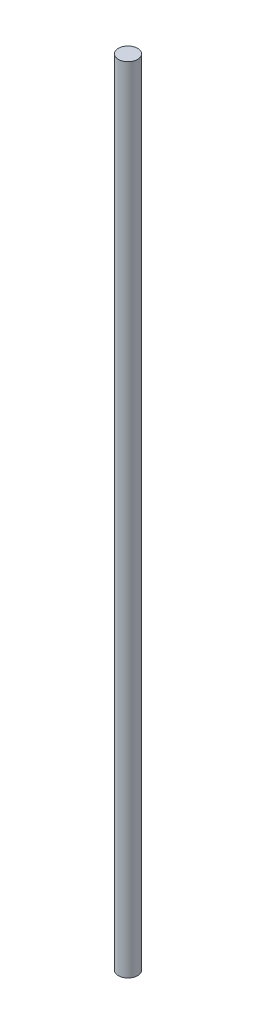
ISO-10303-21;
HEADER;
FILE_DESCRIPTION(('STEP AP214'),'2;1');
FILE_NAME('part.step','',(''),(''),'','','');
FILE_SCHEMA(('AUTOMOTIVE_DESIGN { 1 0 10303 214 1 1 1 1 }'));
ENDSEC;
DATA;
#1=APPLICATION_CONTEXT('core data for automotive mechanical design processes');
#2=APPLICATION_PROTOCOL_DEFINITION('international standard','automotive_design',2000,#1);
#3=PRODUCT_CONTEXT('',#1,'mechanical');
#4=PRODUCT('Part','Part','',(#3));
#5=PRODUCT_RELATED_PRODUCT_CATEGORY('part','',(#4));
#6=PRODUCT_DEFINITION_FORMATION('','',#4);
#7=PRODUCT_DEFINITION_CONTEXT('part definition',#1,'design');
#8=PRODUCT_DEFINITION('design','',#6,#7);
#9=PRODUCT_DEFINITION_SHAPE('','',#8);
#10=(LENGTH_UNIT() NAMED_UNIT(*) SI_UNIT(.MILLI.,.METRE.));
#11=(NAMED_UNIT(*) PLANE_ANGLE_UNIT() SI_UNIT($,.RADIAN.));
#12=(NAMED_UNIT(*) SI_UNIT($,.STERADIAN.) SOLID_ANGLE_UNIT());
#13=UNCERTAINTY_MEASURE_WITH_UNIT(LENGTH_MEASURE(1.E-05),#10,'distance_accuracy_value','');
#14=(GEOMETRIC_REPRESENTATION_CONTEXT(3) GLOBAL_UNCERTAINTY_ASSIGNED_CONTEXT((#13)) GLOBAL_UNIT_ASSIGNED_CONTEXT((#10,
#11,#12)) REPRESENTATION_CONTEXT('',''));
#15=CARTESIAN_POINT('',(0.,0.,0.));
#16=DIRECTION('',(0.,0.,1.));
#17=DIRECTION('',(1.,0.,0.));
#18=AXIS2_PLACEMENT_3D('',#15,#16,#17);
#19=CARTESIAN_POINT('',(0.,165.,0.));
#20=DIRECTION('',(0.,-1.,0.));
#21=DIRECTION('',(0.,0.,-1.));
#22=AXIS2_PLACEMENT_3D('',#19,#20,#21);
#23=CYLINDRICAL_SURFACE('',#22,2.);
#24=CARTESIAN_POINT('',(0.,165.,0.));
#25=DIRECTION('',(0.,1.,0.));
#26=DIRECTION('',(0.,0.,1.));
#27=AXIS2_PLACEMENT_3D('',#24,#25,#26);
#28=CIRCLE('',#27,2.);
#29=CARTESIAN_POINT('',(0.,165.,2.));
#30=VERTEX_POINT('',#29);
#31=EDGE_CURVE('E10',#30,#30,#28,.T.);
#32=ORIENTED_EDGE('',*,*,#31,.F.);
#33=EDGE_LOOP('',(#32));
#34=FACE_BOUND('',#33,.T.);
#35=CARTESIAN_POINT('',(0.,0.,0.));
#36=DIRECTION('',(0.,1.,0.));
#37=DIRECTION('',(0.,0.,1.));
#38=AXIS2_PLACEMENT_3D('',#35,#36,#37);
#39=CIRCLE('',#38,2.);
#40=CARTESIAN_POINT('',(0.,0.,2.));
#41=VERTEX_POINT('',#40);
#42=EDGE_CURVE('E38',#41,#41,#39,.T.);
#43=ORIENTED_EDGE('',*,*,#42,.T.);
#44=EDGE_LOOP('',(#43));
#45=FACE_BOUND('',#44,.T.);
#46=ADVANCED_FACE('F35',(#34,#45),#23,.T.);
#47=CARTESIAN_POINT('',(0.,165.,0.));
#48=DIRECTION('',(0.,1.,0.));
#49=DIRECTION('',(0.,0.,1.));
#50=AXIS2_PLACEMENT_3D('',#47,#48,#49);
#51=PLANE('',#50);
#52=ORIENTED_EDGE('',*,*,#31,.T.);
#53=EDGE_LOOP('',(#52));
#54=FACE_BOUND('',#53,.T.);
#55=ADVANCED_FACE('F50',(#54),#51,.T.);
#56=CARTESIAN_POINT('',(0.,0.,0.));
#57=DIRECTION('',(0.,1.,0.));
#58=DIRECTION('',(0.,0.,1.));
#59=AXIS2_PLACEMENT_3D('',#56,#57,#58);
#60=PLANE('',#59);
#61=ORIENTED_EDGE('',*,*,#42,.F.);
#62=EDGE_LOOP('',(#61));
#63=FACE_BOUND('',#62,.T.);
#64=ADVANCED_FACE('F48',(#63),#60,.F.);
#65=CLOSED_SHELL('',(#46,#55,#64));
#66=MANIFOLD_SOLID_BREP('B2',#65);
#67=ADVANCED_BREP_SHAPE_REPRESENTATION('',(#18,#66),#14);
#68=SHAPE_DEFINITION_REPRESENTATION(#9,#67);
ENDSEC;
END-ISO-10303-21;
